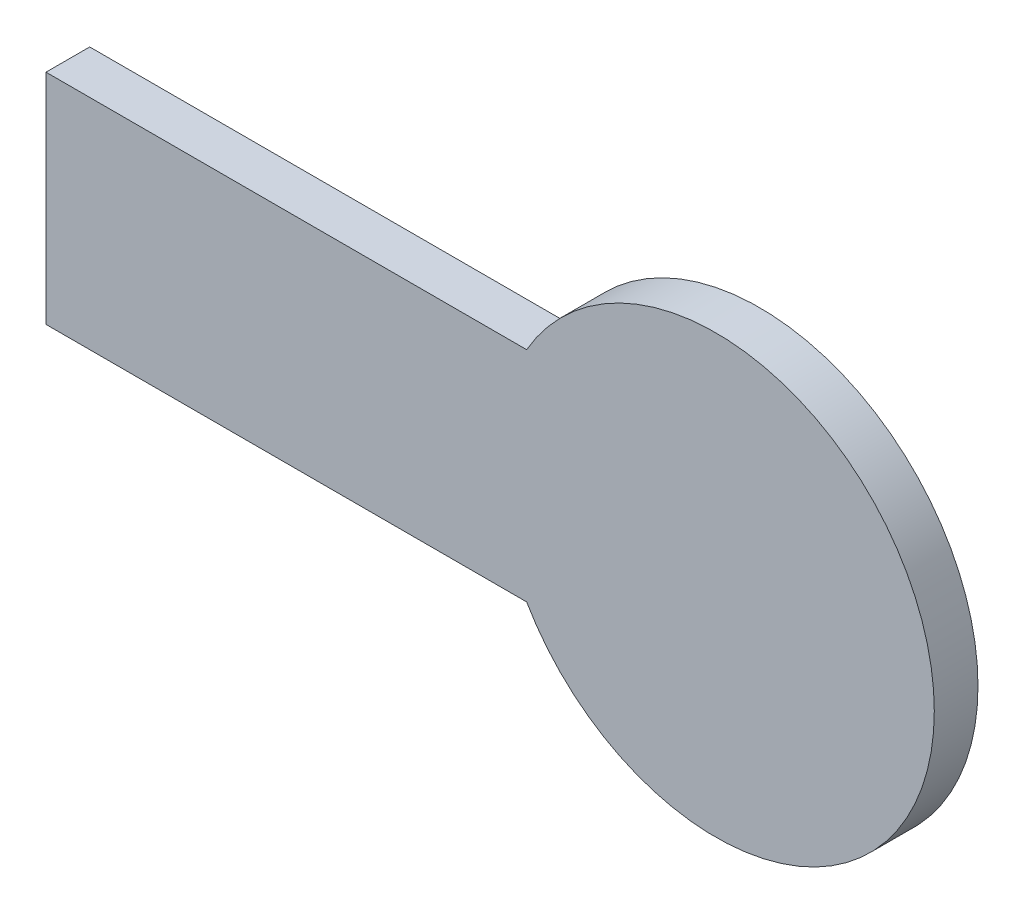
ISO-10303-21;
HEADER;
FILE_DESCRIPTION(('STEP AP214'),'2;1');
FILE_NAME('part.step','',(''),(''),'','','');
FILE_SCHEMA(('AUTOMOTIVE_DESIGN { 1 0 10303 214 1 1 1 1 }'));
ENDSEC;
DATA;
#1=APPLICATION_CONTEXT('core data for automotive mechanical design processes');
#2=APPLICATION_PROTOCOL_DEFINITION('international standard','automotive_design',2000,#1);
#3=PRODUCT_CONTEXT('',#1,'mechanical');
#4=PRODUCT('Part','Part','',(#3));
#5=PRODUCT_RELATED_PRODUCT_CATEGORY('part','',(#4));
#6=PRODUCT_DEFINITION_FORMATION('','',#4);
#7=PRODUCT_DEFINITION_CONTEXT('part definition',#1,'design');
#8=PRODUCT_DEFINITION('design','',#6,#7);
#9=PRODUCT_DEFINITION_SHAPE('','',#8);
#10=(LENGTH_UNIT() NAMED_UNIT(*) SI_UNIT(.MILLI.,.METRE.));
#11=(NAMED_UNIT(*) PLANE_ANGLE_UNIT() SI_UNIT($,.RADIAN.));
#12=(NAMED_UNIT(*) SI_UNIT($,.STERADIAN.) SOLID_ANGLE_UNIT());
#13=UNCERTAINTY_MEASURE_WITH_UNIT(LENGTH_MEASURE(1.E-05),#10,'distance_accuracy_value','');
#14=(GEOMETRIC_REPRESENTATION_CONTEXT(3) GLOBAL_UNCERTAINTY_ASSIGNED_CONTEXT((#13)) GLOBAL_UNIT_ASSIGNED_CONTEXT((#10,
#11,#12)) REPRESENTATION_CONTEXT('',''));
#15=CARTESIAN_POINT('',(0.,0.,0.));
#16=DIRECTION('',(0.,0.,1.));
#17=DIRECTION('',(1.,0.,0.));
#18=AXIS2_PLACEMENT_3D('',#15,#16,#17);
#19=CARTESIAN_POINT('',(0.,0.,10.));
#20=DIRECTION('',(0.,0.,-1.));
#21=DIRECTION('',(-1.,0.,0.));
#22=AXIS2_PLACEMENT_3D('',#19,#20,#21);
#23=CYLINDRICAL_SURFACE('',#22,50.);
#24=CARTESIAN_POINT('',(0.,0.,0.));
#25=DIRECTION('',(0.,0.,1.));
#26=DIRECTION('',(1.,0.,0.));
#27=AXIS2_PLACEMENT_3D('',#24,#25,#26);
#28=CIRCLE('',#27,50.);
#29=CARTESIAN_POINT('',(-43.3012701892219,-25.,0.));
#30=VERTEX_POINT('',#29);
#31=CARTESIAN_POINT('',(-43.3012701892219,25.,0.));
#32=VERTEX_POINT('',#31);
#33=EDGE_CURVE('E96',#30,#32,#28,.T.);
#34=ORIENTED_EDGE('',*,*,#33,.T.);
#35=DIRECTION('',(0.,0.,-1.));
#36=VECTOR('',#35,1.);
#37=CARTESIAN_POINT('',(-43.3012701892219,25.,10.));
#38=LINE('',#37,#36);
#39=CARTESIAN_POINT('',(-43.3012701892219,25.,10.));
#40=VERTEX_POINT('',#39);
#41=EDGE_CURVE('E11',#40,#32,#38,.T.);
#42=ORIENTED_EDGE('',*,*,#41,.F.);
#43=CARTESIAN_POINT('',(0.,0.,10.));
#44=DIRECTION('',(0.,0.,1.));
#45=DIRECTION('',(1.,0.,0.));
#46=AXIS2_PLACEMENT_3D('',#43,#44,#45);
#47=CIRCLE('',#46,50.);
#48=CARTESIAN_POINT('',(-43.3012701892219,-25.,10.));
#49=VERTEX_POINT('',#48);
#50=EDGE_CURVE('E84',#49,#40,#47,.T.);
#51=ORIENTED_EDGE('',*,*,#50,.F.);
#52=DIRECTION('',(0.,0.,-1.));
#53=VECTOR('',#52,1.);
#54=CARTESIAN_POINT('',(-43.3012701892219,-25.,10.));
#55=LINE('',#54,#53);
#56=EDGE_CURVE('E92',#49,#30,#55,.T.);
#57=ORIENTED_EDGE('',*,*,#56,.T.);
#58=EDGE_LOOP('',(#34,#42,#51,#57));
#59=FACE_BOUND('',#58,.T.);
#60=ADVANCED_FACE('F33',(#59),#23,.T.);
#61=CARTESIAN_POINT('',(-153.301270189222,25.,10.));
#62=DIRECTION('',(0.,-1.,0.));
#63=DIRECTION('',(0.,0.,-1.));
#64=AXIS2_PLACEMENT_3D('',#61,#62,#63);
#65=PLANE('',#64);
#66=DIRECTION('',(-1.,0.,0.));
#67=VECTOR('',#66,1.);
#68=CARTESIAN_POINT('',(-153.301270189222,25.,0.));
#69=LINE('',#68,#67);
#70=CARTESIAN_POINT('',(-153.301270189222,25.,0.));
#71=VERTEX_POINT('',#70);
#72=EDGE_CURVE('E88',#32,#71,#69,.T.);
#73=ORIENTED_EDGE('',*,*,#72,.T.);
#74=DIRECTION('',(0.,0.,-1.));
#75=VECTOR('',#74,1.);
#76=CARTESIAN_POINT('',(-153.301270189222,25.,10.));
#77=LINE('',#76,#75);
#78=CARTESIAN_POINT('',(-153.301270189222,25.,10.));
#79=VERTEX_POINT('',#78);
#80=EDGE_CURVE('E41',#79,#71,#77,.T.);
#81=ORIENTED_EDGE('',*,*,#80,.F.);
#82=DIRECTION('',(-1.,0.,0.));
#83=VECTOR('',#82,1.);
#84=CARTESIAN_POINT('',(-153.301270189222,25.,10.));
#85=LINE('',#84,#83);
#86=EDGE_CURVE('E79',#40,#79,#85,.T.);
#87=ORIENTED_EDGE('',*,*,#86,.F.);
#88=ORIENTED_EDGE('',*,*,#41,.T.);
#89=EDGE_LOOP('',(#73,#81,#87,#88));
#90=FACE_BOUND('',#89,.T.);
#91=ADVANCED_FACE('F87',(#90),#65,.F.);
#92=CARTESIAN_POINT('',(-153.301270189222,-25.,10.));
#93=DIRECTION('',(1.,0.,0.));
#94=DIRECTION('',(0.,0.,-1.));
#95=AXIS2_PLACEMENT_3D('',#92,#93,#94);
#96=PLANE('',#95);
#97=DIRECTION('',(0.,-1.,0.));
#98=VECTOR('',#97,1.);
#99=CARTESIAN_POINT('',(-153.301270189222,-25.,0.));
#100=LINE('',#99,#98);
#101=CARTESIAN_POINT('',(-153.301270189222,-25.,0.));
#102=VERTEX_POINT('',#101);
#103=EDGE_CURVE('E66',#71,#102,#100,.T.);
#104=ORIENTED_EDGE('',*,*,#103,.T.);
#105=DIRECTION('',(0.,0.,-1.));
#106=VECTOR('',#105,1.);
#107=CARTESIAN_POINT('',(-153.301270189222,-25.,10.));
#108=LINE('',#107,#106);
#109=CARTESIAN_POINT('',(-153.301270189222,-25.,10.));
#110=VERTEX_POINT('',#109);
#111=EDGE_CURVE('E89',#110,#102,#108,.T.);
#112=ORIENTED_EDGE('',*,*,#111,.F.);
#113=DIRECTION('',(0.,-1.,0.));
#114=VECTOR('',#113,1.);
#115=CARTESIAN_POINT('',(-153.301270189222,-25.,10.));
#116=LINE('',#115,#114);
#117=EDGE_CURVE('E82',#79,#110,#116,.T.);
#118=ORIENTED_EDGE('',*,*,#117,.F.);
#119=ORIENTED_EDGE('',*,*,#80,.T.);
#120=EDGE_LOOP('',(#104,#112,#118,#119));
#121=FACE_BOUND('',#120,.T.);
#122=ADVANCED_FACE('F90',(#121),#96,.F.);
#123=CARTESIAN_POINT('',(-153.301270189222,-25.,10.));
#124=DIRECTION('',(0.,1.,0.));
#125=DIRECTION('',(0.,0.,1.));
#126=AXIS2_PLACEMENT_3D('',#123,#124,#125);
#127=PLANE('',#126);
#128=DIRECTION('',(1.,0.,0.));
#129=VECTOR('',#128,1.);
#130=CARTESIAN_POINT('',(-153.301270189222,-25.,0.));
#131=LINE('',#130,#129);
#132=EDGE_CURVE('E72',#102,#30,#131,.T.);
#133=ORIENTED_EDGE('',*,*,#132,.T.);
#134=ORIENTED_EDGE('',*,*,#56,.F.);
#135=DIRECTION('',(1.,0.,0.));
#136=VECTOR('',#135,1.);
#137=CARTESIAN_POINT('',(-153.301270189222,-25.,10.));
#138=LINE('',#137,#136);
#139=EDGE_CURVE('E49',#110,#49,#138,.T.);
#140=ORIENTED_EDGE('',*,*,#139,.F.);
#141=ORIENTED_EDGE('',*,*,#111,.T.);
#142=EDGE_LOOP('',(#133,#134,#140,#141));
#143=FACE_BOUND('',#142,.T.);
#144=ADVANCED_FACE('F103',(#143),#127,.F.);
#145=CARTESIAN_POINT('',(0.,0.,10.));
#146=DIRECTION('',(0.,0.,1.));
#147=DIRECTION('',(1.,0.,0.));
#148=AXIS2_PLACEMENT_3D('',#145,#146,#147);
#149=PLANE('',#148);
#150=ORIENTED_EDGE('',*,*,#50,.T.);
#151=ORIENTED_EDGE('',*,*,#86,.T.);
#152=ORIENTED_EDGE('',*,*,#117,.T.);
#153=ORIENTED_EDGE('',*,*,#139,.T.);
#154=EDGE_LOOP('',(#150,#151,#152,#153));
#155=FACE_BOUND('',#154,.T.);
#156=ADVANCED_FACE('F80',(#155),#149,.T.);
#157=CARTESIAN_POINT('',(0.,0.,0.));
#158=DIRECTION('',(0.,0.,1.));
#159=DIRECTION('',(1.,0.,0.));
#160=AXIS2_PLACEMENT_3D('',#157,#158,#159);
#161=PLANE('',#160);
#162=ORIENTED_EDGE('',*,*,#33,.F.);
#163=ORIENTED_EDGE('',*,*,#132,.F.);
#164=ORIENTED_EDGE('',*,*,#103,.F.);
#165=ORIENTED_EDGE('',*,*,#72,.F.);
#166=EDGE_LOOP('',(#162,#163,#164,#165));
#167=FACE_BOUND('',#166,.T.);
#168=ADVANCED_FACE('F106',(#167),#161,.F.);
#169=CLOSED_SHELL('',(#60,#91,#122,#144,#156,#168));
#170=MANIFOLD_SOLID_BREP('B2',#169);
#171=ADVANCED_BREP_SHAPE_REPRESENTATION('',(#18,#170),#14);
#172=SHAPE_DEFINITION_REPRESENTATION(#9,#171);
ENDSEC;
END-ISO-10303-21;
